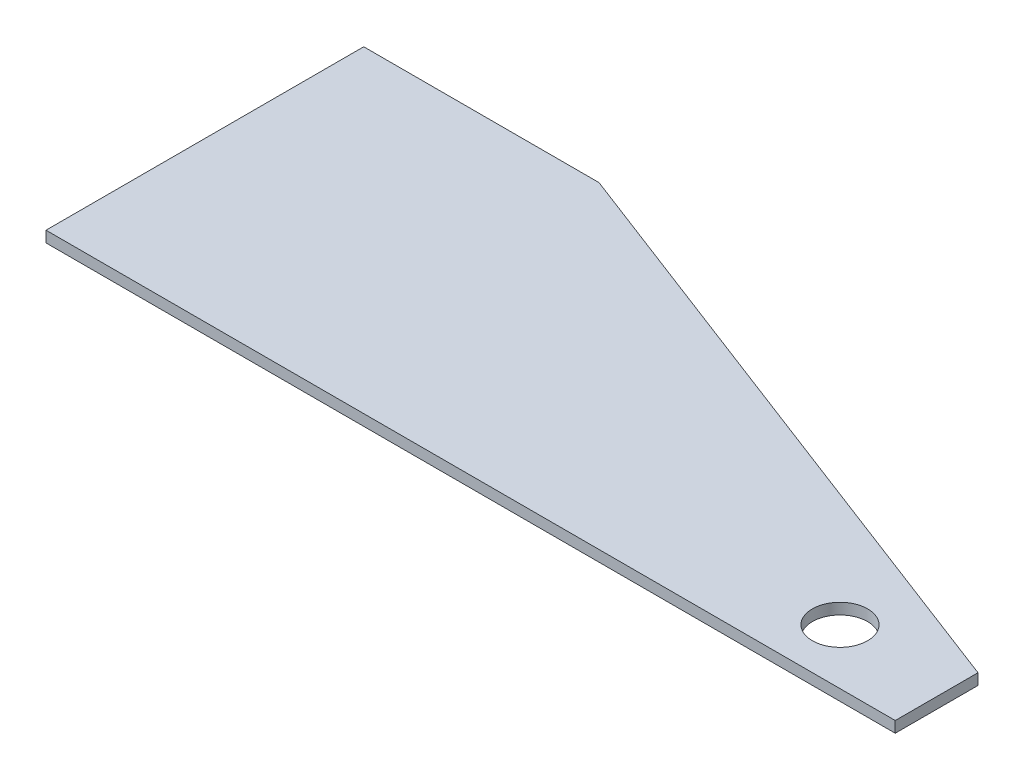
ISO-10303-21;
HEADER;
FILE_DESCRIPTION(('STEP AP214'),'2;1');
FILE_NAME('part.step','',(''),(''),'','','');
FILE_SCHEMA(('AUTOMOTIVE_DESIGN { 1 0 10303 214 1 1 1 1 }'));
ENDSEC;
DATA;
#1=APPLICATION_CONTEXT('core data for automotive mechanical design processes');
#2=APPLICATION_PROTOCOL_DEFINITION('international standard','automotive_design',2000,#1);
#3=PRODUCT_CONTEXT('',#1,'mechanical');
#4=PRODUCT('Part','Part','',(#3));
#5=PRODUCT_RELATED_PRODUCT_CATEGORY('part','',(#4));
#6=PRODUCT_DEFINITION_FORMATION('','',#4);
#7=PRODUCT_DEFINITION_CONTEXT('part definition',#1,'design');
#8=PRODUCT_DEFINITION('design','',#6,#7);
#9=PRODUCT_DEFINITION_SHAPE('','',#8);
#10=(LENGTH_UNIT() NAMED_UNIT(*) SI_UNIT(.MILLI.,.METRE.));
#11=(NAMED_UNIT(*) PLANE_ANGLE_UNIT() SI_UNIT($,.RADIAN.));
#12=(NAMED_UNIT(*) SI_UNIT($,.STERADIAN.) SOLID_ANGLE_UNIT());
#13=UNCERTAINTY_MEASURE_WITH_UNIT(LENGTH_MEASURE(1.E-05),#10,'distance_accuracy_value','');
#14=(GEOMETRIC_REPRESENTATION_CONTEXT(3) GLOBAL_UNCERTAINTY_ASSIGNED_CONTEXT((#13)) GLOBAL_UNIT_ASSIGNED_CONTEXT((#10,
#11,#12)) REPRESENTATION_CONTEXT('',''));
#15=CARTESIAN_POINT('',(0.,0.,0.));
#16=DIRECTION('',(0.,0.,1.));
#17=DIRECTION('',(1.,0.,0.));
#18=AXIS2_PLACEMENT_3D('',#15,#16,#17);
#19=CARTESIAN_POINT('',(0.,2.,57.5086958546241));
#20=DIRECTION('',(1.,0.,0.));
#21=DIRECTION('',(0.,0.,-1.));
#22=AXIS2_PLACEMENT_3D('',#19,#20,#21);
#23=PLANE('',#22);
#24=DIRECTION('',(0.,0.,1.));
#25=VECTOR('',#24,1.);
#26=CARTESIAN_POINT('',(0.,0.,57.5086958546241));
#27=LINE('',#26,#25);
#28=CARTESIAN_POINT('',(0.,0.,0.));
#29=VERTEX_POINT('',#28);
#30=CARTESIAN_POINT('',(0.,0.,57.5086958546241));
#31=VERTEX_POINT('',#30);
#32=EDGE_CURVE('E107',#29,#31,#27,.T.);
#33=ORIENTED_EDGE('',*,*,#32,.T.);
#34=DIRECTION('',(0.,-1.,0.));
#35=VECTOR('',#34,1.);
#36=CARTESIAN_POINT('',(0.,2.,57.5086958546241));
#37=LINE('',#36,#35);
#38=CARTESIAN_POINT('',(0.,2.,57.5086958546241));
#39=VERTEX_POINT('',#38);
#40=EDGE_CURVE('E11',#39,#31,#37,.T.);
#41=ORIENTED_EDGE('',*,*,#40,.F.);
#42=DIRECTION('',(0.,0.,1.));
#43=VECTOR('',#42,1.);
#44=CARTESIAN_POINT('',(0.,2.,57.5086958546241));
#45=LINE('',#44,#43);
#46=CARTESIAN_POINT('',(0.,2.,0.));
#47=VERTEX_POINT('',#46);
#48=EDGE_CURVE('E116',#47,#39,#45,.T.);
#49=ORIENTED_EDGE('',*,*,#48,.F.);
#50=DIRECTION('',(0.,-1.,0.));
#51=VECTOR('',#50,1.);
#52=CARTESIAN_POINT('',(0.,2.,0.));
#53=LINE('',#52,#51);
#54=EDGE_CURVE('E103',#47,#29,#53,.T.);
#55=ORIENTED_EDGE('',*,*,#54,.T.);
#56=EDGE_LOOP('',(#33,#41,#49,#55));
#57=FACE_BOUND('',#56,.T.);
#58=ADVANCED_FACE('F33',(#57),#23,.F.);
#59=CARTESIAN_POINT('',(153.715208146251,2.,57.508695854624));
#60=DIRECTION('',(0.,0.,-1.));
#61=DIRECTION('',(-1.,0.,0.));
#62=AXIS2_PLACEMENT_3D('',#59,#60,#61);
#63=PLANE('',#62);
#64=DIRECTION('',(1.,0.,0.));
#65=VECTOR('',#64,1.);
#66=CARTESIAN_POINT('',(153.715208146251,0.,57.508695854624));
#67=LINE('',#66,#65);
#68=CARTESIAN_POINT('',(153.715208146251,0.,57.508695854624));
#69=VERTEX_POINT('',#68);
#70=EDGE_CURVE('E110',#31,#69,#67,.T.);
#71=ORIENTED_EDGE('',*,*,#70,.T.);
#72=DIRECTION('',(0.,-1.,0.));
#73=VECTOR('',#72,1.);
#74=CARTESIAN_POINT('',(153.715208146251,2.,57.508695854624));
#75=LINE('',#74,#73);
#76=CARTESIAN_POINT('',(153.715208146251,2.,57.508695854624));
#77=VERTEX_POINT('',#76);
#78=EDGE_CURVE('E41',#77,#69,#75,.T.);
#79=ORIENTED_EDGE('',*,*,#78,.F.);
#80=DIRECTION('',(1.,0.,0.));
#81=VECTOR('',#80,1.);
#82=CARTESIAN_POINT('',(153.715208146251,2.,57.508695854624));
#83=LINE('',#82,#81);
#84=EDGE_CURVE('E83',#39,#77,#83,.T.);
#85=ORIENTED_EDGE('',*,*,#84,.F.);
#86=ORIENTED_EDGE('',*,*,#40,.T.);
#87=EDGE_LOOP('',(#71,#79,#85,#86));
#88=FACE_BOUND('',#87,.T.);
#89=ADVANCED_FACE('F136',(#88),#63,.F.);
#90=CARTESIAN_POINT('',(153.715208146251,2.,42.5297953718158));
#91=DIRECTION('',(-1.,0.,0.));
#92=DIRECTION('',(0.,0.,1.));
#93=AXIS2_PLACEMENT_3D('',#90,#91,#92);
#94=PLANE('',#93);
#95=DIRECTION('',(0.,0.,-1.));
#96=VECTOR('',#95,1.);
#97=CARTESIAN_POINT('',(153.715208146251,0.,42.5297953718158));
#98=LINE('',#97,#96);
#99=CARTESIAN_POINT('',(153.715208146251,0.,42.5297953718158));
#100=VERTEX_POINT('',#99);
#101=EDGE_CURVE('E98',#69,#100,#98,.T.);
#102=ORIENTED_EDGE('',*,*,#101,.T.);
#103=DIRECTION('',(0.,-1.,0.));
#104=VECTOR('',#103,1.);
#105=CARTESIAN_POINT('',(153.715208146251,2.,42.5297953718158));
#106=LINE('',#105,#104);
#107=CARTESIAN_POINT('',(153.715208146251,2.,42.5297953718158));
#108=VERTEX_POINT('',#107);
#109=EDGE_CURVE('E95',#108,#100,#106,.T.);
#110=ORIENTED_EDGE('',*,*,#109,.F.);
#111=DIRECTION('',(0.,0.,-1.));
#112=VECTOR('',#111,1.);
#113=CARTESIAN_POINT('',(153.715208146251,2.,42.5297953718158));
#114=LINE('',#113,#112);
#115=EDGE_CURVE('E87',#77,#108,#114,.T.);
#116=ORIENTED_EDGE('',*,*,#115,.F.);
#117=ORIENTED_EDGE('',*,*,#78,.T.);
#118=EDGE_LOOP('',(#102,#110,#116,#117));
#119=FACE_BOUND('',#118,.T.);
#120=ADVANCED_FACE('F96',(#119),#94,.F.);
#121=CARTESIAN_POINT('',(42.5925284239383,2.,0.));
#122=DIRECTION('',(-0.357443302627341,0.,0.933934840021968));
#123=DIRECTION('',(0.933934840021968,0.,0.357443302627341));
#124=AXIS2_PLACEMENT_3D('',#121,#122,#123);
#125=PLANE('',#124);
#126=DIRECTION('',(-0.933934840021968,0.,-0.357443302627341));
#127=VECTOR('',#126,1.);
#128=CARTESIAN_POINT('',(42.5925284239383,0.,0.));
#129=LINE('',#128,#127);
#130=CARTESIAN_POINT('',(42.5925284239383,0.,0.));
#131=VERTEX_POINT('',#130);
#132=EDGE_CURVE('E69',#100,#131,#129,.T.);
#133=ORIENTED_EDGE('',*,*,#132,.T.);
#134=DIRECTION('',(0.,-1.,0.));
#135=VECTOR('',#134,1.);
#136=CARTESIAN_POINT('',(42.5925284239383,2.,0.));
#137=LINE('',#136,#135);
#138=CARTESIAN_POINT('',(42.5925284239383,2.,0.));
#139=VERTEX_POINT('',#138);
#140=EDGE_CURVE('E99',#139,#131,#137,.T.);
#141=ORIENTED_EDGE('',*,*,#140,.F.);
#142=DIRECTION('',(-0.933934840021968,0.,-0.357443302627341));
#143=VECTOR('',#142,1.);
#144=CARTESIAN_POINT('',(42.5925284239383,2.,0.));
#145=LINE('',#144,#143);
#146=EDGE_CURVE('E91',#108,#139,#145,.T.);
#147=ORIENTED_EDGE('',*,*,#146,.F.);
#148=ORIENTED_EDGE('',*,*,#109,.T.);
#149=EDGE_LOOP('',(#133,#141,#147,#148));
#150=FACE_BOUND('',#149,.T.);
#151=ADVANCED_FACE('F101',(#150),#125,.F.);
#152=CARTESIAN_POINT('',(0.,2.,0.));
#153=DIRECTION('',(0.,0.,1.));
#154=DIRECTION('',(1.,0.,0.));
#155=AXIS2_PLACEMENT_3D('',#152,#153,#154);
#156=PLANE('',#155);
#157=DIRECTION('',(-1.,0.,0.));
#158=VECTOR('',#157,1.);
#159=CARTESIAN_POINT('',(0.,0.,0.));
#160=LINE('',#159,#158);
#161=EDGE_CURVE('E75',#131,#29,#160,.T.);
#162=ORIENTED_EDGE('',*,*,#161,.T.);
#163=ORIENTED_EDGE('',*,*,#54,.F.);
#164=DIRECTION('',(-1.,0.,0.));
#165=VECTOR('',#164,1.);
#166=CARTESIAN_POINT('',(0.,2.,0.));
#167=LINE('',#166,#165);
#168=EDGE_CURVE('E49',#139,#47,#167,.T.);
#169=ORIENTED_EDGE('',*,*,#168,.F.);
#170=ORIENTED_EDGE('',*,*,#140,.T.);
#171=EDGE_LOOP('',(#162,#163,#169,#170));
#172=FACE_BOUND('',#171,.T.);
#173=ADVANCED_FACE('F124',(#172),#156,.F.);
#174=CARTESIAN_POINT('',(0.,2.,0.));
#175=DIRECTION('',(0.,-1.,0.));
#176=DIRECTION('',(0.,0.,-1.));
#177=AXIS2_PLACEMENT_3D('',#174,#175,#176);
#178=PLANE('',#177);
#179=CARTESIAN_POINT('',(133.715208146251,2.,47.5086958546241));
#180=DIRECTION('',(0.,1.,0.));
#181=DIRECTION('',(0.,0.,1.));
#182=AXIS2_PLACEMENT_3D('',#179,#180,#181);
#183=CIRCLE('',#182,5.00000000000002);
#184=CARTESIAN_POINT('',(133.715208146251,2.,52.5086958546241));
#185=VERTEX_POINT('',#184);
#186=EDGE_CURVE('E187',#185,#185,#183,.T.);
#187=ORIENTED_EDGE('',*,*,#186,.F.);
#188=EDGE_LOOP('',(#187));
#189=FACE_BOUND('',#188,.T.);
#190=ORIENTED_EDGE('',*,*,#48,.T.);
#191=ORIENTED_EDGE('',*,*,#84,.T.);
#192=ORIENTED_EDGE('',*,*,#115,.T.);
#193=ORIENTED_EDGE('',*,*,#146,.T.);
#194=ORIENTED_EDGE('',*,*,#168,.T.);
#195=EDGE_LOOP('',(#190,#191,#192,#193,#194));
#196=FACE_BOUND('',#195,.T.);
#197=ADVANCED_FACE('F89',(#189,#196),#178,.F.);
#198=CARTESIAN_POINT('',(0.,0.,0.));
#199=DIRECTION('',(0.,-1.,0.));
#200=DIRECTION('',(0.,0.,-1.));
#201=AXIS2_PLACEMENT_3D('',#198,#199,#200);
#202=PLANE('',#201);
#203=CARTESIAN_POINT('',(133.715208146251,0.,47.5086958546241));
#204=DIRECTION('',(0.,1.,0.));
#205=DIRECTION('',(0.,0.,1.));
#206=AXIS2_PLACEMENT_3D('',#203,#204,#205);
#207=CIRCLE('',#206,5.00000000000002);
#208=CARTESIAN_POINT('',(133.715208146251,0.,52.5086958546241));
#209=VERTEX_POINT('',#208);
#210=EDGE_CURVE('E111',#209,#209,#207,.T.);
#211=ORIENTED_EDGE('',*,*,#210,.T.);
#212=EDGE_LOOP('',(#211));
#213=FACE_BOUND('',#212,.T.);
#214=ORIENTED_EDGE('',*,*,#32,.F.);
#215=ORIENTED_EDGE('',*,*,#161,.F.);
#216=ORIENTED_EDGE('',*,*,#132,.F.);
#217=ORIENTED_EDGE('',*,*,#101,.F.);
#218=ORIENTED_EDGE('',*,*,#70,.F.);
#219=EDGE_LOOP('',(#214,#215,#216,#217,#218));
#220=FACE_BOUND('',#219,.T.);
#221=ADVANCED_FACE('F120',(#213,#220),#202,.T.);
#222=CARTESIAN_POINT('',(133.715208146251,0.,47.5086958546241));
#223=DIRECTION('',(0.,1.,0.));
#224=DIRECTION('',(0.,0.,1.));
#225=AXIS2_PLACEMENT_3D('',#222,#223,#224);
#226=CYLINDRICAL_SURFACE('',#225,5.00000000000002);
#227=ORIENTED_EDGE('',*,*,#210,.F.);
#228=EDGE_LOOP('',(#227));
#229=FACE_BOUND('',#228,.T.);
#230=ORIENTED_EDGE('',*,*,#186,.T.);
#231=EDGE_LOOP('',(#230));
#232=FACE_BOUND('',#231,.T.);
#233=ADVANCED_FACE('F169',(#229,#232),#226,.F.);
#234=CLOSED_SHELL('',(#58,#89,#120,#151,#173,#197,#221,#233));
#235=MANIFOLD_SOLID_BREP('B2',#234);
#236=ADVANCED_BREP_SHAPE_REPRESENTATION('',(#18,#235),#14);
#237=SHAPE_DEFINITION_REPRESENTATION(#9,#236);
ENDSEC;
END-ISO-10303-21;
